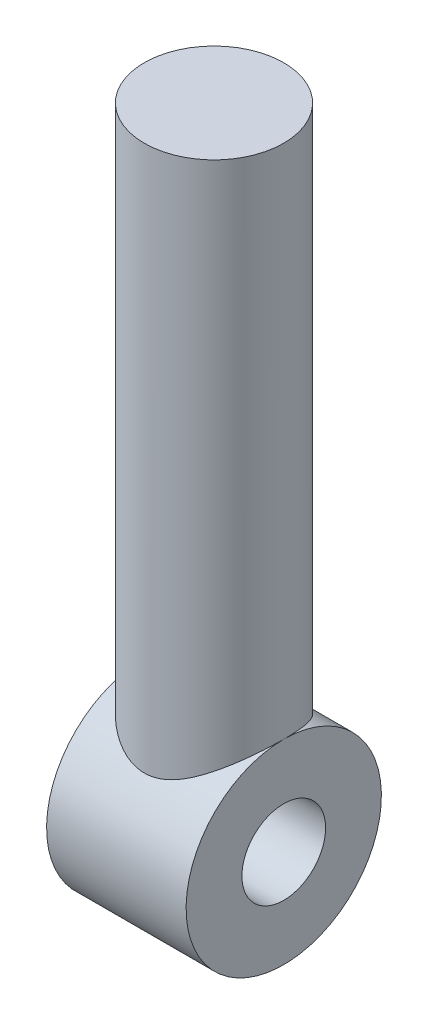
ISO-10303-21;
HEADER;
FILE_DESCRIPTION(('STEP AP214'),'2;1');
FILE_NAME('part.step','',(''),(''),'','','');
FILE_SCHEMA(('AUTOMOTIVE_DESIGN { 1 0 10303 214 1 1 1 1 }'));
ENDSEC;
DATA;
#1=APPLICATION_CONTEXT('core data for automotive mechanical design processes');
#2=APPLICATION_PROTOCOL_DEFINITION('international standard','automotive_design',2000,#1);
#3=PRODUCT_CONTEXT('',#1,'mechanical');
#4=PRODUCT('Part','Part','',(#3));
#5=PRODUCT_RELATED_PRODUCT_CATEGORY('part','',(#4));
#6=PRODUCT_DEFINITION_FORMATION('','',#4);
#7=PRODUCT_DEFINITION_CONTEXT('part definition',#1,'design');
#8=PRODUCT_DEFINITION('design','',#6,#7);
#9=PRODUCT_DEFINITION_SHAPE('','',#8);
#10=(LENGTH_UNIT() NAMED_UNIT(*) SI_UNIT(.MILLI.,.METRE.));
#11=(NAMED_UNIT(*) PLANE_ANGLE_UNIT() SI_UNIT($,.RADIAN.));
#12=(NAMED_UNIT(*) SI_UNIT($,.STERADIAN.) SOLID_ANGLE_UNIT());
#13=UNCERTAINTY_MEASURE_WITH_UNIT(LENGTH_MEASURE(1.E-05),#10,'distance_accuracy_value','');
#14=(GEOMETRIC_REPRESENTATION_CONTEXT(3) GLOBAL_UNCERTAINTY_ASSIGNED_CONTEXT((#13)) GLOBAL_UNIT_ASSIGNED_CONTEXT((#10,
#11,#12)) REPRESENTATION_CONTEXT('',''));
#15=CARTESIAN_POINT('',(0.,0.,0.));
#16=DIRECTION('',(0.,0.,1.));
#17=DIRECTION('',(1.,0.,0.));
#18=AXIS2_PLACEMENT_3D('',#15,#16,#17);
#19=CARTESIAN_POINT('',(-1.25,0.,0.));
#20=DIRECTION('',(1.,0.,0.));
#21=DIRECTION('',(0.,0.,-1.));
#22=AXIS2_PLACEMENT_3D('',#19,#20,#21);
#23=CYLINDRICAL_SURFACE('',#22,1.75);
#24=CARTESIAN_POINT('',(0.,1.22474487139159,-1.25));
#25=CARTESIAN_POINT('',(-0.0595529696782451,1.22474304942473,-1.25000113878815));
#26=CARTESIAN_POINT('',(-0.119100616930046,1.22917443864513,-1.24570473720215));
#27=CARTESIAN_POINT('',(-0.235958461148627,1.24591481785065,-1.2289534458233));
#28=CARTESIAN_POINT('',(-0.293262781204082,1.25824319848623,-1.21647847219764));
#29=CARTESIAN_POINT('',(-0.40345879830746,1.28840575797274,-1.18447536214374));
#30=CARTESIAN_POINT('',(-0.456394334207042,1.30617372652521,-1.16503158830197));
#31=CARTESIAN_POINT('',(-0.558112013949313,1.34509448521861,-1.11987035037745));
#32=CARTESIAN_POINT('',(-0.606894319442639,1.36624714352945,-1.09415313061839));
#33=CARTESIAN_POINT('',(-0.708758137960503,1.41419933901286,-1.03167862473772));
#34=CARTESIAN_POINT('',(-0.760975802491956,1.44132123555464,-0.993760266149209));
#35=CARTESIAN_POINT('',(-0.859085895700566,1.49544568021096,-0.910288078591556));
#36=CARTESIAN_POINT('',(-0.904969805964378,1.52244802121667,-0.864724145806571));
#37=CARTESIAN_POINT('',(-0.99718991063633,1.57887045348912,-0.757595099069316));
#38=CARTESIAN_POINT('',(-1.04217413037939,1.60787500231288,-0.694625209449819));
#39=CARTESIAN_POINT('',(-1.12046807396806,1.65969615836735,-0.559559320060222));
#40=CARTESIAN_POINT('',(-1.1538023462554,1.68252575403928,-0.487482951217853));
#41=CARTESIAN_POINT('',(-1.19922620192138,1.71404781599875,-0.357353045469455));
#42=CARTESIAN_POINT('',(-1.21464623678663,1.72490637912273,-0.30097762456184));
#43=CARTESIAN_POINT('',(-1.23749263841917,1.74106896215847,-0.185864188024748));
#44=CARTESIAN_POINT('',(-1.24492553949464,1.7463775224548,-0.127128144508455));
#45=CARTESIAN_POINT('',(-1.25137474712601,1.75098078363936,-0.00883102684159252));
#46=CARTESIAN_POINT('',(-1.25037320552428,1.75026273160014,0.0507315304516833));
#47=CARTESIAN_POINT('',(-1.23997431334383,1.74284917113415,0.168743379715217));
#48=CARTESIAN_POINT('',(-1.23057472514928,1.73615206962108,0.227192370742192));
#49=CARTESIAN_POINT('',(-1.20426996399424,1.71760943890499,0.339846831807772));
#50=CARTESIAN_POINT('',(-1.18756614171022,1.70590219385611,0.394123099462758));
#51=CARTESIAN_POINT('',(-1.14746944091579,1.67823597889748,0.498966386132505));
#52=CARTESIAN_POINT('',(-1.12407520176934,1.66227614417991,0.549532648008918));
#53=CARTESIAN_POINT('',(-1.0684574118156,1.62515356801652,0.651649596599107));
#54=CARTESIAN_POINT('',(-1.03554020379504,1.60360910456743,0.702681303115436));
#55=CARTESIAN_POINT('',(-0.963356325186894,1.5579707747488,0.798788868913126));
#56=CARTESIAN_POINT('',(-0.924083216750892,1.5338743321405,0.843858604339025));
#57=CARTESIAN_POINT('',(-0.832101190840163,1.48011653767395,0.935449662778367));
#58=CARTESIAN_POINT('',(-0.778250175833641,1.45024852851582,0.980705442306912));
#59=CARTESIAN_POINT('',(-0.6632068557331,1.39189826122174,1.06189134270194));
#60=CARTESIAN_POINT('',(-0.602014957184694,1.36341592646842,1.09782197965601));
#61=CARTESIAN_POINT('',(-0.48725107545651,1.31731476668484,1.15245853194151));
#62=CARTESIAN_POINT('',(-0.435067729520885,1.29869408947577,1.17322129824346));
#63=CARTESIAN_POINT('',(-0.326972230852882,1.26659436569089,1.20780686876608));
#64=CARTESIAN_POINT('',(-0.27106719999139,1.25310581265891,1.22164251955588));
#65=CARTESIAN_POINT('',(-0.155887560382301,1.23331539864056,1.24162966167527));
#66=CARTESIAN_POINT('',(-0.0965813966464914,1.22709868380631,1.24769019185046));
#67=CARTESIAN_POINT('',(0.022540864658391,1.22350980887168,1.25121316951412));
#68=CARTESIAN_POINT('',(0.0823565684859932,1.22613134562694,1.24868174448796));
#69=CARTESIAN_POINT('',(0.190695231776886,1.23851495876392,1.23637869315102));
#70=CARTESIAN_POINT('',(0.239508515729787,1.24708266381058,1.22781494161703));
#71=CARTESIAN_POINT('',(0.334823772020313,1.26883815751193,1.20531933940302));
#72=CARTESIAN_POINT('',(0.381322950950572,1.28203138231868,1.19138117049528));
#73=CARTESIAN_POINT('',(0.493130361076649,1.31878409019689,1.1508111923713));
#74=CARTESIAN_POINT('',(0.556752666059566,1.34427958163588,1.12129781282337));
#75=CARTESIAN_POINT('',(0.677268593657933,1.39849427702861,1.05291275263757));
#76=CARTESIAN_POINT('',(0.734148403349365,1.42721987159609,1.01402233973727));
#77=CARTESIAN_POINT('',(0.841962967833543,1.48553249506883,0.926563955590026));
#78=CARTESIAN_POINT('',(0.892733723629586,1.51512429016922,0.877796588036531));
#79=CARTESIAN_POINT('',(0.985908915065174,1.57183184147132,0.771658432520618));
#80=CARTESIAN_POINT('',(1.02832488039249,1.59895098178446,0.714299696045287));
#81=CARTESIAN_POINT('',(1.09790223663628,1.64463079610222,0.600718392183554));
#82=CARTESIAN_POINT('',(1.12639235631378,1.66386413121549,0.545584827356541));
#83=CARTESIAN_POINT('',(1.17523569953207,1.6973100250272,0.43038048992974));
#84=CARTESIAN_POINT('',(1.19559355204096,1.71152543943879,0.370312549570804));
#85=CARTESIAN_POINT('',(1.2271821693469,1.73373829244317,0.246256922018859));
#86=CARTESIAN_POINT('',(1.23835415968288,1.74169567602367,0.182246767675134));
#87=CARTESIAN_POINT('',(1.2505730638589,1.75040379647474,0.0527878751330795));
#88=CARTESIAN_POINT('',(1.25162531094248,1.7511583293449,-0.0126600870898969));
#89=CARTESIAN_POINT('',(1.24398555486539,1.74570783631181,-0.135574668461611));
#90=CARTESIAN_POINT('',(1.23632813056228,1.74024169492608,-0.193143439949369));
#91=CARTESIAN_POINT('',(1.21334846652497,1.72399204869256,-0.305940290579476));
#92=CARTESIAN_POINT('',(1.19802492658861,1.71320764185132,-0.361167970939796));
#93=CARTESIAN_POINT('',(1.16000527884499,1.68683740983549,-0.469311091958666));
#94=CARTESIAN_POINT('',(1.13714431228782,1.67114466452118,-0.52214164692364));
#95=CARTESIAN_POINT('',(1.08504718993276,1.63614048686511,-0.623225075594567));
#96=CARTESIAN_POINT('',(1.05580985745769,1.61682838671011,-0.671477102029682));
#97=CARTESIAN_POINT('',(0.986798697563335,1.5725656330192,-0.769989132712431));
#98=CARTESIAN_POINT('',(0.946095412070817,1.54720469518571,-0.819412079712614));
#99=CARTESIAN_POINT('',(0.858067738437003,1.49499922171894,-0.911193407383643));
#100=CARTESIAN_POINT('',(0.810731082278037,1.46815199424041,-0.953538372109418));
#101=CARTESIAN_POINT('',(0.701316740213476,1.41042902347451,-1.03739942970278));
#102=CARTESIAN_POINT('',(0.638104183525541,1.37965522518731,-1.077518445657));
#103=CARTESIAN_POINT('',(0.503798658153662,1.32292539848802,-1.14645501932956));
#104=CARTESIAN_POINT('',(0.43272004144862,1.29696081961031,-1.17529273798407));
#105=CARTESIAN_POINT('',(0.301377161568214,1.2601076459367,-1.21457067763706));
#106=CARTESIAN_POINT('',(0.24255215163524,1.24710326277072,-1.227753345597));
#107=CARTESIAN_POINT('',(0.122477385789558,1.22943592627246,-1.24545379709728));
#108=CARTESIAN_POINT('',(0.0612358791497471,1.22474674484548,-1.2499988290308));
#109=CARTESIAN_POINT('',(0.,1.22474487139159,-1.25));
#110=B_SPLINE_CURVE_WITH_KNOTS('',3,(#24,#25,#26,#27,#28,#29,#30,#31,#32,#33,#34,#35,#36,#37,
#38,#39,#40,#41,#42,#43,#44,#45,#46,#47,#48,#49,#50,#51,#52,#53,#54,#55,#56,#57,#58,#59,#60,#61,
#62,#63,#64,#65,#66,#67,#68,#69,#70,#71,#72,#73,#74,#75,#76,#77,#78,#79,#80,#81,#82,#83,#84,#85,
#86,#87,#88,#89,#90,#91,#92,#93,#94,#95,#96,#97,#98,#99,#100,#101,#102,#103,#104,#105,#106,#107,
#108,#109),.UNSPECIFIED.,.T.,.F.,(4,2,2,2,2,2,2,2,2,2,2,2,2,2,2,2,2,2,2,2,2,2,2,2,2,2,2,2,2,2,2,
2,2,2,2,2,2,2,2,2,2,2,4),(0.,0.178367784638105,0.357175229760188,0.53388739300157,
0.710592675164261,0.919854777961744,1.12939563579317,1.37595259129664,1.62198683129379,
1.79956585644296,1.97699949256987,2.1548086909123,2.3326652797242,2.50590090440653,
2.67917178525672,2.87176390396011,3.06455233307616,3.29289976439196,3.52123455542721,
3.69813355343157,3.87470325971262,4.0533203624292,4.23181010837765,4.3820823027899,
4.53253170023111,4.75520182003367,4.97832050243919,5.20649708707211,5.43435654517519,
5.62848173291277,5.82249626465274,6.01774271786101,6.21288626786733,6.3870676323335,
6.56127854863694,6.73958514545461,6.91792467436985,7.12375540297224,7.3299719543365,
7.5716815540498,7.81295719657677,7.99694686855663,8.18035515471464),.UNSPECIFIED.);
#111=CARTESIAN_POINT('',(-1.25000000000005,1.75000000000003,0.));
#112=VERTEX_POINT('',#111);
#113=CARTESIAN_POINT('',(1.25,1.75,0.));
#114=VERTEX_POINT('',#113);
#115=EDGE_CURVE('E11',#112,#114,#110,.T.);
#116=ORIENTED_EDGE('',*,*,#115,.F.);
#117=CARTESIAN_POINT('',(-1.25,0.,0.));
#118=DIRECTION('',(1.,0.,0.));
#119=DIRECTION('',(0.,0.,-1.));
#120=AXIS2_PLACEMENT_3D('',#117,#118,#119);
#121=CIRCLE('',#120,1.75);
#122=EDGE_CURVE('E58',#112,#112,#121,.T.);
#123=ORIENTED_EDGE('',*,*,#122,.T.);
#124=EDGE_CURVE('E44',#114,#112,#110,.T.);
#125=ORIENTED_EDGE('',*,*,#124,.F.);
#126=CARTESIAN_POINT('',(1.25,0.,0.));
#127=DIRECTION('',(1.,0.,0.));
#128=DIRECTION('',(0.,0.,-1.));
#129=AXIS2_PLACEMENT_3D('',#126,#127,#128);
#130=CIRCLE('',#129,1.75);
#131=EDGE_CURVE('E65',#114,#114,#130,.T.);
#132=ORIENTED_EDGE('',*,*,#131,.F.);
#133=EDGE_LOOP('',(#116,#123,#125,#132));
#134=FACE_BOUND('',#133,.T.);
#135=ADVANCED_FACE('F39',(#134),#23,.T.);
#136=CARTESIAN_POINT('',(-1.25,0.,0.));
#137=DIRECTION('',(1.,0.,0.));
#138=DIRECTION('',(0.,0.,-1.));
#139=AXIS2_PLACEMENT_3D('',#136,#137,#138);
#140=PLANE('',#139);
#141=CARTESIAN_POINT('',(-1.25,0.,0.));
#142=DIRECTION('',(1.,0.,0.));
#143=DIRECTION('',(0.,0.,-1.));
#144=AXIS2_PLACEMENT_3D('',#141,#142,#143);
#145=CIRCLE('',#144,0.75);
#146=CARTESIAN_POINT('',(-1.25,0.,-0.75));
#147=VERTEX_POINT('',#146);
#148=EDGE_CURVE('E72',#147,#147,#145,.T.);
#149=ORIENTED_EDGE('',*,*,#148,.T.);
#150=EDGE_LOOP('',(#149));
#151=FACE_BOUND('',#150,.T.);
#152=ORIENTED_EDGE('',*,*,#122,.F.);
#153=EDGE_LOOP('',(#152));
#154=FACE_BOUND('',#153,.T.);
#155=ADVANCED_FACE('F93',(#151,#154),#140,.F.);
#156=CARTESIAN_POINT('',(1.25,0.,0.));
#157=DIRECTION('',(1.,0.,0.));
#158=DIRECTION('',(0.,0.,-1.));
#159=AXIS2_PLACEMENT_3D('',#156,#157,#158);
#160=PLANE('',#159);
#161=CARTESIAN_POINT('',(1.25,0.,0.));
#162=DIRECTION('',(1.,0.,0.));
#163=DIRECTION('',(0.,0.,-1.));
#164=AXIS2_PLACEMENT_3D('',#161,#162,#163);
#165=CIRCLE('',#164,0.75);
#166=CARTESIAN_POINT('',(1.25,0.,-0.75));
#167=VERTEX_POINT('',#166);
#168=EDGE_CURVE('E78',#167,#167,#165,.T.);
#169=ORIENTED_EDGE('',*,*,#168,.F.);
#170=EDGE_LOOP('',(#169));
#171=FACE_BOUND('',#170,.T.);
#172=ORIENTED_EDGE('',*,*,#131,.T.);
#173=EDGE_LOOP('',(#172));
#174=FACE_BOUND('',#173,.T.);
#175=ADVANCED_FACE('F70',(#171,#174),#160,.T.);
#176=CARTESIAN_POINT('',(0.,11.,0.));
#177=DIRECTION('',(0.,-1.,0.));
#178=DIRECTION('',(0.,0.,-1.));
#179=AXIS2_PLACEMENT_3D('',#176,#177,#178);
#180=CYLINDRICAL_SURFACE('',#179,1.25);
#181=CARTESIAN_POINT('',(0.,11.,0.));
#182=DIRECTION('',(0.,1.,0.));
#183=DIRECTION('',(0.,0.,1.));
#184=AXIS2_PLACEMENT_3D('',#181,#182,#183);
#185=CIRCLE('',#184,1.25);
#186=CARTESIAN_POINT('',(0.,11.,1.25));
#187=VERTEX_POINT('',#186);
#188=EDGE_CURVE('E68',#187,#187,#185,.T.);
#189=ORIENTED_EDGE('',*,*,#188,.F.);
#190=EDGE_LOOP('',(#189));
#191=FACE_BOUND('',#190,.T.);
#192=ORIENTED_EDGE('',*,*,#124,.T.);
#193=ORIENTED_EDGE('',*,*,#115,.T.);
#194=EDGE_LOOP('',(#192,#193));
#195=FACE_BOUND('',#194,.T.);
#196=ADVANCED_FACE('F41',(#191,#195),#180,.T.);
#197=CARTESIAN_POINT('',(0.,11.,0.));
#198=DIRECTION('',(0.,1.,0.));
#199=DIRECTION('',(0.,0.,1.));
#200=AXIS2_PLACEMENT_3D('',#197,#198,#199);
#201=PLANE('',#200);
#202=ORIENTED_EDGE('',*,*,#188,.T.);
#203=EDGE_LOOP('',(#202));
#204=FACE_BOUND('',#203,.T.);
#205=ADVANCED_FACE('F85',(#204),#201,.T.);
#206=CARTESIAN_POINT('',(-1.75,0.,0.));
#207=DIRECTION('',(1.,0.,0.));
#208=DIRECTION('',(0.,0.,-1.));
#209=AXIS2_PLACEMENT_3D('',#206,#207,#208);
#210=CYLINDRICAL_SURFACE('',#209,0.75);
#211=ORIENTED_EDGE('',*,*,#168,.T.);
#212=EDGE_LOOP('',(#211));
#213=FACE_BOUND('',#212,.T.);
#214=ORIENTED_EDGE('',*,*,#148,.F.);
#215=EDGE_LOOP('',(#214));
#216=FACE_BOUND('',#215,.T.);
#217=ADVANCED_FACE('F92',(#213,#216),#210,.F.);
#218=CLOSED_SHELL('',(#135,#155,#175,#196,#205,#217));
#219=MANIFOLD_SOLID_BREP('B2',#218);
#220=ADVANCED_BREP_SHAPE_REPRESENTATION('',(#18,#219),#14);
#221=SHAPE_DEFINITION_REPRESENTATION(#9,#220);
ENDSEC;
END-ISO-10303-21;
